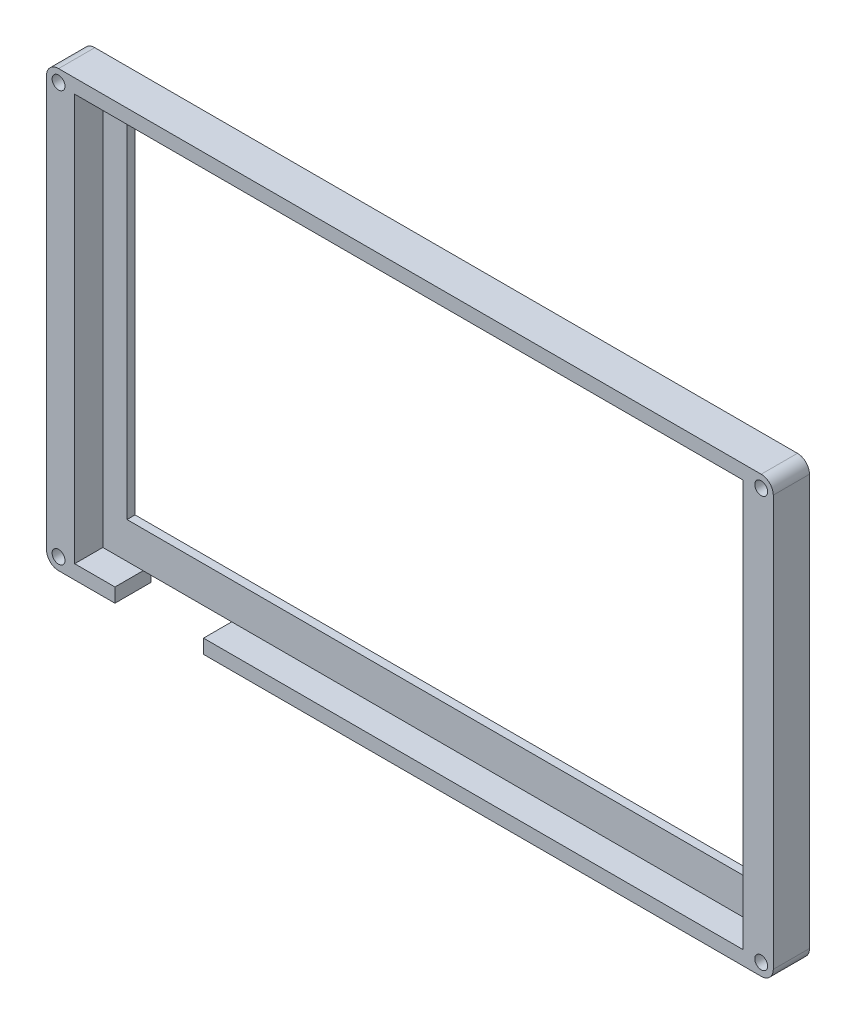
ISO-10303-21;
HEADER;
FILE_DESCRIPTION(('STEP AP214'),'2;1');
FILE_NAME('part.step','',(''),(''),'','','');
FILE_SCHEMA(('AUTOMOTIVE_DESIGN { 1 0 10303 214 1 1 1 1 }'));
ENDSEC;
DATA;
#1=APPLICATION_CONTEXT('core data for automotive mechanical design processes');
#2=APPLICATION_PROTOCOL_DEFINITION('international standard','automotive_design',2000,#1);
#3=PRODUCT_CONTEXT('',#1,'mechanical');
#4=PRODUCT('Part','Part','',(#3));
#5=PRODUCT_RELATED_PRODUCT_CATEGORY('part','',(#4));
#6=PRODUCT_DEFINITION_FORMATION('','',#4);
#7=PRODUCT_DEFINITION_CONTEXT('part definition',#1,'design');
#8=PRODUCT_DEFINITION('design','',#6,#7);
#9=PRODUCT_DEFINITION_SHAPE('','',#8);
#10=(LENGTH_UNIT() NAMED_UNIT(*) SI_UNIT(.MILLI.,.METRE.));
#11=(NAMED_UNIT(*) PLANE_ANGLE_UNIT() SI_UNIT($,.RADIAN.));
#12=(NAMED_UNIT(*) SI_UNIT($,.STERADIAN.) SOLID_ANGLE_UNIT());
#13=UNCERTAINTY_MEASURE_WITH_UNIT(LENGTH_MEASURE(1.E-05),#10,'distance_accuracy_value','');
#14=(GEOMETRIC_REPRESENTATION_CONTEXT(3) GLOBAL_UNCERTAINTY_ASSIGNED_CONTEXT((#13)) GLOBAL_UNIT_ASSIGNED_CONTEXT((#10,
#11,#12)) REPRESENTATION_CONTEXT('',''));
#15=CARTESIAN_POINT('',(0.,0.,0.));
#16=DIRECTION('',(0.,0.,1.));
#17=DIRECTION('',(1.,0.,0.));
#18=AXIS2_PLACEMENT_3D('',#15,#16,#17);
#19=CARTESIAN_POINT('',(3.,3.,9.));
#20=DIRECTION('',(0.,0.,-1.));
#21=DIRECTION('',(-1.,0.,0.));
#22=AXIS2_PLACEMENT_3D('',#19,#20,#21);
#23=PLANE('',#22);
#24=CARTESIAN_POINT('',(3.,3.,9.));
#25=DIRECTION('',(0.,0.,1.));
#26=DIRECTION('',(1.,0.,0.));
#27=AXIS2_PLACEMENT_3D('',#24,#25,#26);
#28=CIRCLE('',#27,1.6);
#29=CARTESIAN_POINT('',(4.6,3.,9.));
#30=VERTEX_POINT('',#29);
#31=EDGE_CURVE('E368',#30,#30,#28,.T.);
#32=ORIENTED_EDGE('',*,*,#31,.F.);
#33=EDGE_LOOP('',(#32));
#34=FACE_BOUND('',#33,.T.);
#35=CARTESIAN_POINT('',(177.5,105.,9.));
#36=DIRECTION('',(0.,0.,1.));
#37=DIRECTION('',(1.,0.,0.));
#38=AXIS2_PLACEMENT_3D('',#35,#36,#37);
#39=CIRCLE('',#38,1.59999999999999);
#40=CARTESIAN_POINT('',(179.1,105.,9.));
#41=VERTEX_POINT('',#40);
#42=EDGE_CURVE('E360',#41,#41,#39,.T.);
#43=ORIENTED_EDGE('',*,*,#42,.F.);
#44=EDGE_LOOP('',(#43));
#45=FACE_BOUND('',#44,.T.);
#46=CARTESIAN_POINT('',(2.99999999999998,105.,9.));
#47=DIRECTION('',(0.,0.,1.));
#48=DIRECTION('',(1.,0.,0.));
#49=AXIS2_PLACEMENT_3D('',#46,#47,#48);
#50=CIRCLE('',#49,1.6);
#51=CARTESIAN_POINT('',(4.59999999999998,105.,9.));
#52=VERTEX_POINT('',#51);
#53=EDGE_CURVE('E352',#52,#52,#50,.T.);
#54=ORIENTED_EDGE('',*,*,#53,.F.);
#55=EDGE_LOOP('',(#54));
#56=FACE_BOUND('',#55,.T.);
#57=CARTESIAN_POINT('',(177.5,3.,9.));
#58=DIRECTION('',(0.,0.,1.));
#59=DIRECTION('',(1.,0.,0.));
#60=AXIS2_PLACEMENT_3D('',#57,#58,#59);
#61=CIRCLE('',#60,1.59999999999999);
#62=CARTESIAN_POINT('',(179.1,3.,9.));
#63=VERTEX_POINT('',#62);
#64=EDGE_CURVE('E344',#63,#63,#61,.T.);
#65=ORIENTED_EDGE('',*,*,#64,.F.);
#66=EDGE_LOOP('',(#65));
#67=FACE_BOUND('',#66,.T.);
#68=DIRECTION('',(0.,1.,0.));
#69=VECTOR('',#68,1.);
#70=CARTESIAN_POINT('',(17.,0.,9.));
#71=LINE('',#70,#69);
#72=CARTESIAN_POINT('',(17.,0.,9.));
#73=VERTEX_POINT('',#72);
#74=CARTESIAN_POINT('',(17.,3.5,9.));
#75=VERTEX_POINT('',#74);
#76=EDGE_CURVE('E192',#73,#75,#71,.T.);
#77=ORIENTED_EDGE('',*,*,#76,.T.);
#78=DIRECTION('',(1.,0.,0.));
#79=VECTOR('',#78,1.);
#80=CARTESIAN_POINT('',(6.99999999999999,3.5,9.));
#81=LINE('',#80,#79);
#82=CARTESIAN_POINT('',(6.99999999999999,3.5,9.));
#83=VERTEX_POINT('',#82);
#84=EDGE_CURVE('E322',#83,#75,#81,.T.);
#85=ORIENTED_EDGE('',*,*,#84,.F.);
#86=DIRECTION('',(0.,-1.,0.));
#87=VECTOR('',#86,1.);
#88=CARTESIAN_POINT('',(6.99999999999998,104.5,9.));
#89=LINE('',#88,#87);
#90=CARTESIAN_POINT('',(6.99999999999998,104.5,9.));
#91=VERTEX_POINT('',#90);
#92=EDGE_CURVE('E326',#91,#83,#89,.T.);
#93=ORIENTED_EDGE('',*,*,#92,.F.);
#94=DIRECTION('',(1.,0.,0.));
#95=VECTOR('',#94,1.);
#96=CARTESIAN_POINT('',(6.99999999999998,104.5,9.));
#97=LINE('',#96,#95);
#98=CARTESIAN_POINT('',(173.,104.5,9.));
#99=VERTEX_POINT('',#98);
#100=EDGE_CURVE('E312',#91,#99,#97,.T.);
#101=ORIENTED_EDGE('',*,*,#100,.T.);
#102=DIRECTION('',(0.,-1.,0.));
#103=VECTOR('',#102,1.);
#104=CARTESIAN_POINT('',(173.,104.5,9.));
#105=LINE('',#104,#103);
#106=CARTESIAN_POINT('',(173.,3.5,9.));
#107=VERTEX_POINT('',#106);
#108=EDGE_CURVE('E316',#99,#107,#105,.T.);
#109=ORIENTED_EDGE('',*,*,#108,.T.);
#110=CARTESIAN_POINT('',(39.,3.5,9.));
#111=VERTEX_POINT('',#110);
#112=EDGE_CURVE('E321',#111,#107,#81,.T.);
#113=ORIENTED_EDGE('',*,*,#112,.F.);
#114=DIRECTION('',(0.,-1.,0.));
#115=VECTOR('',#114,1.);
#116=CARTESIAN_POINT('',(39.,0.,9.));
#117=LINE('',#116,#115);
#118=CARTESIAN_POINT('',(39.,0.,9.));
#119=VERTEX_POINT('',#118);
#120=EDGE_CURVE('E59',#111,#119,#117,.T.);
#121=ORIENTED_EDGE('',*,*,#120,.T.);
#122=DIRECTION('',(1.,0.,0.));
#123=VECTOR('',#122,1.);
#124=CARTESIAN_POINT('',(3.,0.,9.));
#125=LINE('',#124,#123);
#126=CARTESIAN_POINT('',(177.5,0.,9.));
#127=VERTEX_POINT('',#126);
#128=EDGE_CURVE('E378',#119,#127,#125,.T.);
#129=ORIENTED_EDGE('',*,*,#128,.T.);
#130=CARTESIAN_POINT('',(177.5,3.,9.));
#131=DIRECTION('',(0.,0.,1.));
#132=DIRECTION('',(1.,0.,0.));
#133=AXIS2_PLACEMENT_3D('',#130,#131,#132);
#134=CIRCLE('',#133,2.99999999999999);
#135=CARTESIAN_POINT('',(180.5,3.,9.));
#136=VERTEX_POINT('',#135);
#137=EDGE_CURVE('E382',#127,#136,#134,.T.);
#138=ORIENTED_EDGE('',*,*,#137,.T.);
#139=DIRECTION('',(0.,1.,0.));
#140=VECTOR('',#139,1.);
#141=CARTESIAN_POINT('',(180.5,3.,9.));
#142=LINE('',#141,#140);
#143=CARTESIAN_POINT('',(180.5,105.,9.));
#144=VERTEX_POINT('',#143);
#145=EDGE_CURVE('E385',#136,#144,#142,.T.);
#146=ORIENTED_EDGE('',*,*,#145,.T.);
#147=CARTESIAN_POINT('',(177.5,105.,9.));
#148=DIRECTION('',(0.,0.,1.));
#149=DIRECTION('',(1.,0.,0.));
#150=AXIS2_PLACEMENT_3D('',#147,#148,#149);
#151=CIRCLE('',#150,2.99999999999997);
#152=CARTESIAN_POINT('',(177.5,108.,9.));
#153=VERTEX_POINT('',#152);
#154=EDGE_CURVE('E388',#144,#153,#151,.T.);
#155=ORIENTED_EDGE('',*,*,#154,.T.);
#156=DIRECTION('',(-1.,0.,0.));
#157=VECTOR('',#156,1.);
#158=CARTESIAN_POINT('',(2.99999999999998,108.,9.));
#159=LINE('',#158,#157);
#160=CARTESIAN_POINT('',(2.99999999999998,108.,9.));
#161=VERTEX_POINT('',#160);
#162=EDGE_CURVE('E391',#153,#161,#159,.T.);
#163=ORIENTED_EDGE('',*,*,#162,.T.);
#164=CARTESIAN_POINT('',(2.99999999999998,105.,9.));
#165=DIRECTION('',(0.,0.,1.));
#166=DIRECTION('',(-1.,0.,0.));
#167=AXIS2_PLACEMENT_3D('',#164,#165,#166);
#168=CIRCLE('',#167,3.);
#169=CARTESIAN_POINT('',(0.,105.,9.));
#170=VERTEX_POINT('',#169);
#171=EDGE_CURVE('E394',#161,#170,#168,.T.);
#172=ORIENTED_EDGE('',*,*,#171,.T.);
#173=DIRECTION('',(0.,-1.,0.));
#174=VECTOR('',#173,1.);
#175=CARTESIAN_POINT('',(0.,3.,9.));
#176=LINE('',#175,#174);
#177=CARTESIAN_POINT('',(0.,3.,9.));
#178=VERTEX_POINT('',#177);
#179=EDGE_CURVE('E247',#170,#178,#176,.T.);
#180=ORIENTED_EDGE('',*,*,#179,.T.);
#181=CARTESIAN_POINT('',(3.,3.,9.));
#182=DIRECTION('',(0.,0.,1.));
#183=DIRECTION('',(-1.,0.,0.));
#184=AXIS2_PLACEMENT_3D('',#181,#182,#183);
#185=CIRCLE('',#184,3.);
#186=CARTESIAN_POINT('',(3.,0.,9.));
#187=VERTEX_POINT('',#186);
#188=EDGE_CURVE('E241',#178,#187,#185,.T.);
#189=ORIENTED_EDGE('',*,*,#188,.T.);
#190=EDGE_CURVE('E379',#187,#73,#125,.T.);
#191=ORIENTED_EDGE('',*,*,#190,.T.);
#192=EDGE_LOOP('',(#77,#85,#93,#101,#109,#113,#121,#129,#138,#146,#155,#163,#172,#180,#189,#191));
#193=FACE_BOUND('',#192,.T.);
#194=ADVANCED_FACE('F43',(#34,#45,#56,#67,#193),#23,.F.);
#195=CARTESIAN_POINT('',(3.,3.,0.));
#196=DIRECTION('',(0.,0.,-1.));
#197=DIRECTION('',(-1.,0.,0.));
#198=AXIS2_PLACEMENT_3D('',#195,#196,#197);
#199=PLANE('',#198);
#200=DIRECTION('',(0.,-1.,0.));
#201=VECTOR('',#200,1.);
#202=CARTESIAN_POINT('',(13.,100.5,0.));
#203=LINE('',#202,#201);
#204=CARTESIAN_POINT('',(13.,100.5,0.));
#205=VERTEX_POINT('',#204);
#206=CARTESIAN_POINT('',(13.,12.5,0.));
#207=VERTEX_POINT('',#206);
#208=EDGE_CURVE('E451',#205,#207,#203,.T.);
#209=ORIENTED_EDGE('',*,*,#208,.T.);
#210=DIRECTION('',(1.,0.,0.));
#211=VECTOR('',#210,1.);
#212=CARTESIAN_POINT('',(13.,12.5,0.));
#213=LINE('',#212,#211);
#214=CARTESIAN_POINT('',(170.,12.5,0.));
#215=VERTEX_POINT('',#214);
#216=EDGE_CURVE('E455',#207,#215,#213,.T.);
#217=ORIENTED_EDGE('',*,*,#216,.T.);
#218=DIRECTION('',(0.,1.,0.));
#219=VECTOR('',#218,1.);
#220=CARTESIAN_POINT('',(170.,100.5,0.));
#221=LINE('',#220,#219);
#222=CARTESIAN_POINT('',(170.,100.5,0.));
#223=VERTEX_POINT('',#222);
#224=EDGE_CURVE('E460',#215,#223,#221,.T.);
#225=ORIENTED_EDGE('',*,*,#224,.T.);
#226=DIRECTION('',(-1.,0.,0.));
#227=VECTOR('',#226,1.);
#228=CARTESIAN_POINT('',(13.,100.5,0.));
#229=LINE('',#228,#227);
#230=EDGE_CURVE('E464',#223,#205,#229,.T.);
#231=ORIENTED_EDGE('',*,*,#230,.T.);
#232=EDGE_LOOP('',(#209,#217,#225,#231));
#233=FACE_BOUND('',#232,.T.);
#234=CARTESIAN_POINT('',(2.99999999999998,105.,0.));
#235=DIRECTION('',(0.,0.,1.));
#236=DIRECTION('',(1.,0.,0.));
#237=AXIS2_PLACEMENT_3D('',#234,#235,#236);
#238=CIRCLE('',#237,1.6);
#239=CARTESIAN_POINT('',(4.59999999999998,105.,0.));
#240=VERTEX_POINT('',#239);
#241=EDGE_CURVE('E348',#240,#240,#238,.T.);
#242=ORIENTED_EDGE('',*,*,#241,.T.);
#243=EDGE_LOOP('',(#242));
#244=FACE_BOUND('',#243,.T.);
#245=CARTESIAN_POINT('',(3.,3.,0.));
#246=DIRECTION('',(0.,0.,1.));
#247=DIRECTION('',(1.,0.,0.));
#248=AXIS2_PLACEMENT_3D('',#245,#246,#247);
#249=CIRCLE('',#248,1.6);
#250=CARTESIAN_POINT('',(4.6,3.,0.));
#251=VERTEX_POINT('',#250);
#252=EDGE_CURVE('E364',#251,#251,#249,.T.);
#253=ORIENTED_EDGE('',*,*,#252,.T.);
#254=EDGE_LOOP('',(#253));
#255=FACE_BOUND('',#254,.T.);
#256=CARTESIAN_POINT('',(177.5,105.,0.));
#257=DIRECTION('',(0.,0.,1.));
#258=DIRECTION('',(1.,0.,0.));
#259=AXIS2_PLACEMENT_3D('',#256,#257,#258);
#260=CIRCLE('',#259,1.59999999999999);
#261=CARTESIAN_POINT('',(179.1,105.,0.));
#262=VERTEX_POINT('',#261);
#263=EDGE_CURVE('E356',#262,#262,#260,.T.);
#264=ORIENTED_EDGE('',*,*,#263,.T.);
#265=EDGE_LOOP('',(#264));
#266=FACE_BOUND('',#265,.T.);
#267=CARTESIAN_POINT('',(177.5,3.,0.));
#268=DIRECTION('',(0.,0.,1.));
#269=DIRECTION('',(1.,0.,0.));
#270=AXIS2_PLACEMENT_3D('',#267,#268,#269);
#271=CIRCLE('',#270,1.59999999999999);
#272=CARTESIAN_POINT('',(179.1,3.,0.));
#273=VERTEX_POINT('',#272);
#274=EDGE_CURVE('E343',#273,#273,#271,.T.);
#275=ORIENTED_EDGE('',*,*,#274,.T.);
#276=EDGE_LOOP('',(#275));
#277=FACE_BOUND('',#276,.T.);
#278=DIRECTION('',(-1.,0.,0.));
#279=VECTOR('',#278,1.);
#280=CARTESIAN_POINT('',(0.,3.5,0.));
#281=LINE('',#280,#279);
#282=CARTESIAN_POINT('',(39.,3.5,0.));
#283=VERTEX_POINT('',#282);
#284=CARTESIAN_POINT('',(17.,3.5,0.));
#285=VERTEX_POINT('',#284);
#286=EDGE_CURVE('E198',#283,#285,#281,.T.);
#287=ORIENTED_EDGE('',*,*,#286,.T.);
#288=DIRECTION('',(0.,1.,0.));
#289=VECTOR('',#288,1.);
#290=CARTESIAN_POINT('',(17.,0.,0.));
#291=LINE('',#290,#289);
#292=CARTESIAN_POINT('',(17.,0.,0.));
#293=VERTEX_POINT('',#292);
#294=EDGE_CURVE('E189',#293,#285,#291,.T.);
#295=ORIENTED_EDGE('',*,*,#294,.F.);
#296=DIRECTION('',(1.,0.,0.));
#297=VECTOR('',#296,1.);
#298=CARTESIAN_POINT('',(3.,0.,0.));
#299=LINE('',#298,#297);
#300=CARTESIAN_POINT('',(3.,0.,0.));
#301=VERTEX_POINT('',#300);
#302=EDGE_CURVE('E204',#301,#293,#299,.T.);
#303=ORIENTED_EDGE('',*,*,#302,.F.);
#304=CARTESIAN_POINT('',(3.,3.,0.));
#305=DIRECTION('',(0.,0.,1.));
#306=DIRECTION('',(-1.,0.,0.));
#307=AXIS2_PLACEMENT_3D('',#304,#305,#306);
#308=CIRCLE('',#307,3.);
#309=CARTESIAN_POINT('',(0.,3.,0.));
#310=VERTEX_POINT('',#309);
#311=EDGE_CURVE('E223',#310,#301,#308,.T.);
#312=ORIENTED_EDGE('',*,*,#311,.F.);
#313=DIRECTION('',(0.,-1.,0.));
#314=VECTOR('',#313,1.);
#315=CARTESIAN_POINT('',(0.,3.,0.));
#316=LINE('',#315,#314);
#317=CARTESIAN_POINT('',(0.,105.,0.));
#318=VERTEX_POINT('',#317);
#319=EDGE_CURVE('E238',#318,#310,#316,.T.);
#320=ORIENTED_EDGE('',*,*,#319,.F.);
#321=CARTESIAN_POINT('',(2.99999999999998,105.,0.));
#322=DIRECTION('',(0.,0.,1.));
#323=DIRECTION('',(-1.,0.,0.));
#324=AXIS2_PLACEMENT_3D('',#321,#322,#323);
#325=CIRCLE('',#324,3.);
#326=CARTESIAN_POINT('',(2.99999999999998,108.,0.));
#327=VERTEX_POINT('',#326);
#328=EDGE_CURVE('E235',#327,#318,#325,.T.);
#329=ORIENTED_EDGE('',*,*,#328,.F.);
#330=DIRECTION('',(-1.,0.,0.));
#331=VECTOR('',#330,1.);
#332=CARTESIAN_POINT('',(2.99999999999998,108.,0.));
#333=LINE('',#332,#331);
#334=CARTESIAN_POINT('',(177.5,108.,0.));
#335=VERTEX_POINT('',#334);
#336=EDGE_CURVE('E232',#335,#327,#333,.T.);
#337=ORIENTED_EDGE('',*,*,#336,.F.);
#338=CARTESIAN_POINT('',(177.5,105.,0.));
#339=DIRECTION('',(0.,0.,1.));
#340=DIRECTION('',(1.,0.,0.));
#341=AXIS2_PLACEMENT_3D('',#338,#339,#340);
#342=CIRCLE('',#341,2.99999999999997);
#343=CARTESIAN_POINT('',(180.5,105.,0.));
#344=VERTEX_POINT('',#343);
#345=EDGE_CURVE('E229',#344,#335,#342,.T.);
#346=ORIENTED_EDGE('',*,*,#345,.F.);
#347=DIRECTION('',(0.,1.,0.));
#348=VECTOR('',#347,1.);
#349=CARTESIAN_POINT('',(180.5,3.,0.));
#350=LINE('',#349,#348);
#351=CARTESIAN_POINT('',(180.5,3.,0.));
#352=VERTEX_POINT('',#351);
#353=EDGE_CURVE('E221',#352,#344,#350,.T.);
#354=ORIENTED_EDGE('',*,*,#353,.F.);
#355=CARTESIAN_POINT('',(177.5,3.,0.));
#356=DIRECTION('',(0.,0.,1.));
#357=DIRECTION('',(1.,0.,0.));
#358=AXIS2_PLACEMENT_3D('',#355,#356,#357);
#359=CIRCLE('',#358,2.99999999999999);
#360=CARTESIAN_POINT('',(177.5,0.,0.));
#361=VERTEX_POINT('',#360);
#362=EDGE_CURVE('E216',#361,#352,#359,.T.);
#363=ORIENTED_EDGE('',*,*,#362,.F.);
#364=CARTESIAN_POINT('',(39.,0.,0.));
#365=VERTEX_POINT('',#364);
#366=EDGE_CURVE('E217',#365,#361,#299,.T.);
#367=ORIENTED_EDGE('',*,*,#366,.F.);
#368=DIRECTION('',(0.,-1.,0.));
#369=VECTOR('',#368,1.);
#370=CARTESIAN_POINT('',(39.,0.,0.));
#371=LINE('',#370,#369);
#372=EDGE_CURVE('E209',#283,#365,#371,.T.);
#373=ORIENTED_EDGE('',*,*,#372,.F.);
#374=EDGE_LOOP('',(#287,#295,#303,#312,#320,#329,#337,#346,#354,#363,#367,#373));
#375=FACE_BOUND('',#374,.T.);
#376=ADVANCED_FACE('F202',(#233,#244,#255,#266,#277,#375),#199,.T.);
#377=CARTESIAN_POINT('',(3.,0.,9.));
#378=DIRECTION('',(0.,1.,0.));
#379=DIRECTION('',(0.,0.,1.));
#380=AXIS2_PLACEMENT_3D('',#377,#378,#379);
#381=PLANE('',#380);
#382=DIRECTION('',(0.,0.,1.));
#383=VECTOR('',#382,1.);
#384=CARTESIAN_POINT('',(17.,0.,0.));
#385=LINE('',#384,#383);
#386=EDGE_CURVE('E185',#293,#73,#385,.T.);
#387=ORIENTED_EDGE('',*,*,#386,.T.);
#388=ORIENTED_EDGE('',*,*,#190,.F.);
#389=DIRECTION('',(0.,0.,-1.));
#390=VECTOR('',#389,1.);
#391=CARTESIAN_POINT('',(3.,0.,9.));
#392=LINE('',#391,#390);
#393=EDGE_CURVE('E213',#187,#301,#392,.T.);
#394=ORIENTED_EDGE('',*,*,#393,.T.);
#395=ORIENTED_EDGE('',*,*,#302,.T.);
#396=EDGE_LOOP('',(#387,#388,#394,#395));
#397=FACE_BOUND('',#396,.T.);
#398=ADVANCED_FACE('F211',(#397),#381,.F.);
#399=DIRECTION('',(0.,0.,1.));
#400=VECTOR('',#399,1.);
#401=CARTESIAN_POINT('',(39.,0.,0.));
#402=LINE('',#401,#400);
#403=EDGE_CURVE('E197',#365,#119,#402,.T.);
#404=ORIENTED_EDGE('',*,*,#403,.F.);
#405=ORIENTED_EDGE('',*,*,#366,.T.);
#406=DIRECTION('',(0.,0.,-1.));
#407=VECTOR('',#406,1.);
#408=CARTESIAN_POINT('',(177.5,0.,9.));
#409=LINE('',#408,#407);
#410=EDGE_CURVE('E267',#127,#361,#409,.T.);
#411=ORIENTED_EDGE('',*,*,#410,.F.);
#412=ORIENTED_EDGE('',*,*,#128,.F.);
#413=EDGE_LOOP('',(#404,#405,#411,#412));
#414=FACE_BOUND('',#413,.T.);
#415=ADVANCED_FACE('F436',(#414),#381,.F.);
#416=CARTESIAN_POINT('',(6.99999999999999,3.5,2.));
#417=DIRECTION('',(0.,-1.,0.));
#418=DIRECTION('',(0.,0.,-1.));
#419=AXIS2_PLACEMENT_3D('',#416,#417,#418);
#420=PLANE('',#419);
#421=DIRECTION('',(0.,0.,1.));
#422=VECTOR('',#421,1.);
#423=CARTESIAN_POINT('',(17.,3.5,2.));
#424=LINE('',#423,#422);
#425=CARTESIAN_POINT('',(17.,3.5,2.));
#426=VERTEX_POINT('',#425);
#427=EDGE_CURVE('E11',#426,#75,#424,.T.);
#428=ORIENTED_EDGE('',*,*,#427,.F.);
#429=DIRECTION('',(1.,0.,0.));
#430=VECTOR('',#429,1.);
#431=CARTESIAN_POINT('',(6.99999999999999,3.5,2.));
#432=LINE('',#431,#430);
#433=CARTESIAN_POINT('',(6.99999999999999,3.5,2.));
#434=VERTEX_POINT('',#433);
#435=EDGE_CURVE('E296',#434,#426,#432,.T.);
#436=ORIENTED_EDGE('',*,*,#435,.F.);
#437=DIRECTION('',(0.,0.,1.));
#438=VECTOR('',#437,1.);
#439=CARTESIAN_POINT('',(6.99999999999999,3.5,2.));
#440=LINE('',#439,#438);
#441=EDGE_CURVE('E334',#434,#83,#440,.T.);
#442=ORIENTED_EDGE('',*,*,#441,.T.);
#443=ORIENTED_EDGE('',*,*,#84,.T.);
#444=EDGE_LOOP('',(#428,#436,#442,#443));
#445=FACE_BOUND('',#444,.T.);
#446=ADVANCED_FACE('F504',(#445),#420,.F.);
#447=DIRECTION('',(0.,0.,-1.));
#448=VECTOR('',#447,1.);
#449=CARTESIAN_POINT('',(39.,3.5,2.));
#450=LINE('',#449,#448);
#451=CARTESIAN_POINT('',(39.,3.5,2.));
#452=VERTEX_POINT('',#451);
#453=EDGE_CURVE('E52',#111,#452,#450,.T.);
#454=ORIENTED_EDGE('',*,*,#453,.F.);
#455=ORIENTED_EDGE('',*,*,#112,.T.);
#456=DIRECTION('',(0.,0.,1.));
#457=VECTOR('',#456,1.);
#458=CARTESIAN_POINT('',(173.,3.5,2.));
#459=LINE('',#458,#457);
#460=CARTESIAN_POINT('',(173.,3.5,2.));
#461=VERTEX_POINT('',#460);
#462=EDGE_CURVE('E290',#461,#107,#459,.T.);
#463=ORIENTED_EDGE('',*,*,#462,.F.);
#464=EDGE_CURVE('E287',#452,#461,#432,.T.);
#465=ORIENTED_EDGE('',*,*,#464,.F.);
#466=EDGE_LOOP('',(#454,#455,#463,#465));
#467=FACE_BOUND('',#466,.T.);
#468=ADVANCED_FACE('F288',(#467),#420,.F.);
#469=CARTESIAN_POINT('',(0.,0.,2.));
#470=DIRECTION('',(0.,0.,-1.));
#471=DIRECTION('',(-1.,0.,0.));
#472=AXIS2_PLACEMENT_3D('',#469,#470,#471);
#473=PLANE('',#472);
#474=DIRECTION('',(1.,0.,0.));
#475=VECTOR('',#474,1.);
#476=CARTESIAN_POINT('',(6.99999999999998,104.5,2.));
#477=LINE('',#476,#475);
#478=CARTESIAN_POINT('',(6.99999999999998,104.5,2.));
#479=VERTEX_POINT('',#478);
#480=CARTESIAN_POINT('',(173.,104.5,2.));
#481=VERTEX_POINT('',#480);
#482=EDGE_CURVE('E330',#479,#481,#477,.T.);
#483=ORIENTED_EDGE('',*,*,#482,.F.);
#484=DIRECTION('',(0.,-1.,0.));
#485=VECTOR('',#484,1.);
#486=CARTESIAN_POINT('',(6.99999999999998,104.5,2.));
#487=LINE('',#486,#485);
#488=EDGE_CURVE('E305',#479,#434,#487,.T.);
#489=ORIENTED_EDGE('',*,*,#488,.T.);
#490=ORIENTED_EDGE('',*,*,#435,.T.);
#491=EDGE_CURVE('E282',#426,#452,#432,.T.);
#492=ORIENTED_EDGE('',*,*,#491,.T.);
#493=ORIENTED_EDGE('',*,*,#464,.T.);
#494=DIRECTION('',(0.,-1.,0.));
#495=VECTOR('',#494,1.);
#496=CARTESIAN_POINT('',(173.,104.5,2.));
#497=LINE('',#496,#495);
#498=EDGE_CURVE('E294',#481,#461,#497,.T.);
#499=ORIENTED_EDGE('',*,*,#498,.F.);
#500=EDGE_LOOP('',(#483,#489,#490,#492,#493,#499));
#501=FACE_BOUND('',#500,.T.);
#502=DIRECTION('',(0.,-1.,0.));
#503=VECTOR('',#502,1.);
#504=CARTESIAN_POINT('',(13.,100.5,2.));
#505=LINE('',#504,#503);
#506=CARTESIAN_POINT('',(13.,100.5,2.));
#507=VERTEX_POINT('',#506);
#508=CARTESIAN_POINT('',(13.,12.5,2.));
#509=VERTEX_POINT('',#508);
#510=EDGE_CURVE('E447',#507,#509,#505,.T.);
#511=ORIENTED_EDGE('',*,*,#510,.F.);
#512=DIRECTION('',(-1.,0.,0.));
#513=VECTOR('',#512,1.);
#514=CARTESIAN_POINT('',(13.,100.5,2.));
#515=LINE('',#514,#513);
#516=CARTESIAN_POINT('',(170.,100.5,2.));
#517=VERTEX_POINT('',#516);
#518=EDGE_CURVE('E456',#517,#507,#515,.T.);
#519=ORIENTED_EDGE('',*,*,#518,.F.);
#520=DIRECTION('',(0.,1.,0.));
#521=VECTOR('',#520,1.);
#522=CARTESIAN_POINT('',(170.,100.5,2.));
#523=LINE('',#522,#521);
#524=CARTESIAN_POINT('',(170.,12.5,2.));
#525=VERTEX_POINT('',#524);
#526=EDGE_CURVE('E67',#525,#517,#523,.T.);
#527=ORIENTED_EDGE('',*,*,#526,.F.);
#528=DIRECTION('',(1.,0.,0.));
#529=VECTOR('',#528,1.);
#530=CARTESIAN_POINT('',(13.,12.5,2.));
#531=LINE('',#530,#529);
#532=EDGE_CURVE('E472',#509,#525,#531,.T.);
#533=ORIENTED_EDGE('',*,*,#532,.F.);
#534=EDGE_LOOP('',(#511,#519,#527,#533));
#535=FACE_BOUND('',#534,.T.);
#536=ADVANCED_FACE('F299',(#501,#535),#473,.F.);
#537=CARTESIAN_POINT('',(3.,3.,9.));
#538=DIRECTION('',(0.,0.,-1.));
#539=DIRECTION('',(-1.,0.,0.));
#540=AXIS2_PLACEMENT_3D('',#537,#538,#539);
#541=CYLINDRICAL_SURFACE('',#540,3.);
#542=ORIENTED_EDGE('',*,*,#311,.T.);
#543=ORIENTED_EDGE('',*,*,#393,.F.);
#544=ORIENTED_EDGE('',*,*,#188,.F.);
#545=DIRECTION('',(0.,0.,-1.));
#546=VECTOR('',#545,1.);
#547=CARTESIAN_POINT('',(0.,3.,9.));
#548=LINE('',#547,#546);
#549=EDGE_CURVE('E242',#178,#310,#548,.T.);
#550=ORIENTED_EDGE('',*,*,#549,.T.);
#551=EDGE_LOOP('',(#542,#543,#544,#550));
#552=FACE_BOUND('',#551,.T.);
#553=ADVANCED_FACE('F45',(#552),#541,.T.);
#554=CARTESIAN_POINT('',(177.5,3.,9.));
#555=DIRECTION('',(0.,0.,-1.));
#556=DIRECTION('',(-1.,0.,0.));
#557=AXIS2_PLACEMENT_3D('',#554,#555,#556);
#558=CYLINDRICAL_SURFACE('',#557,2.99999999999999);
#559=ORIENTED_EDGE('',*,*,#362,.T.);
#560=DIRECTION('',(0.,0.,-1.));
#561=VECTOR('',#560,1.);
#562=CARTESIAN_POINT('',(180.5,3.,9.));
#563=LINE('',#562,#561);
#564=EDGE_CURVE('E263',#136,#352,#563,.T.);
#565=ORIENTED_EDGE('',*,*,#564,.F.);
#566=ORIENTED_EDGE('',*,*,#137,.F.);
#567=ORIENTED_EDGE('',*,*,#410,.T.);
#568=EDGE_LOOP('',(#559,#565,#566,#567));
#569=FACE_BOUND('',#568,.T.);
#570=ADVANCED_FACE('F431',(#569),#558,.T.);
#571=CARTESIAN_POINT('',(180.5,3.,9.));
#572=DIRECTION('',(-1.,0.,0.));
#573=DIRECTION('',(0.,-1.,0.));
#574=AXIS2_PLACEMENT_3D('',#571,#572,#573);
#575=PLANE('',#574);
#576=ORIENTED_EDGE('',*,*,#353,.T.);
#577=DIRECTION('',(0.,0.,-1.));
#578=VECTOR('',#577,1.);
#579=CARTESIAN_POINT('',(180.5,105.,9.));
#580=LINE('',#579,#578);
#581=EDGE_CURVE('E259',#144,#344,#580,.T.);
#582=ORIENTED_EDGE('',*,*,#581,.F.);
#583=ORIENTED_EDGE('',*,*,#145,.F.);
#584=ORIENTED_EDGE('',*,*,#564,.T.);
#585=EDGE_LOOP('',(#576,#582,#583,#584));
#586=FACE_BOUND('',#585,.T.);
#587=ADVANCED_FACE('F426',(#586),#575,.F.);
#588=CARTESIAN_POINT('',(177.5,105.,9.));
#589=DIRECTION('',(0.,0.,-1.));
#590=DIRECTION('',(-1.,0.,0.));
#591=AXIS2_PLACEMENT_3D('',#588,#589,#590);
#592=CYLINDRICAL_SURFACE('',#591,2.99999999999997);
#593=ORIENTED_EDGE('',*,*,#345,.T.);
#594=DIRECTION('',(0.,0.,-1.));
#595=VECTOR('',#594,1.);
#596=CARTESIAN_POINT('',(177.5,108.,9.));
#597=LINE('',#596,#595);
#598=EDGE_CURVE('E255',#153,#335,#597,.T.);
#599=ORIENTED_EDGE('',*,*,#598,.F.);
#600=ORIENTED_EDGE('',*,*,#154,.F.);
#601=ORIENTED_EDGE('',*,*,#581,.T.);
#602=EDGE_LOOP('',(#593,#599,#600,#601));
#603=FACE_BOUND('',#602,.T.);
#604=ADVANCED_FACE('F420',(#603),#592,.T.);
#605=CARTESIAN_POINT('',(2.99999999999998,108.,9.));
#606=DIRECTION('',(0.,-1.,0.));
#607=DIRECTION('',(1.,0.,0.));
#608=AXIS2_PLACEMENT_3D('',#605,#606,#607);
#609=PLANE('',#608);
#610=ORIENTED_EDGE('',*,*,#336,.T.);
#611=DIRECTION('',(0.,0.,-1.));
#612=VECTOR('',#611,1.);
#613=CARTESIAN_POINT('',(2.99999999999998,108.,9.));
#614=LINE('',#613,#612);
#615=EDGE_CURVE('E251',#161,#327,#614,.T.);
#616=ORIENTED_EDGE('',*,*,#615,.F.);
#617=ORIENTED_EDGE('',*,*,#162,.F.);
#618=ORIENTED_EDGE('',*,*,#598,.T.);
#619=EDGE_LOOP('',(#610,#616,#617,#618));
#620=FACE_BOUND('',#619,.T.);
#621=ADVANCED_FACE('F416',(#620),#609,.F.);
#622=CARTESIAN_POINT('',(2.99999999999998,105.,9.));
#623=DIRECTION('',(0.,0.,-1.));
#624=DIRECTION('',(-1.,0.,0.));
#625=AXIS2_PLACEMENT_3D('',#622,#623,#624);
#626=CYLINDRICAL_SURFACE('',#625,3.);
#627=ORIENTED_EDGE('',*,*,#328,.T.);
#628=DIRECTION('',(0.,0.,-1.));
#629=VECTOR('',#628,1.);
#630=CARTESIAN_POINT('',(0.,105.,9.));
#631=LINE('',#630,#629);
#632=EDGE_CURVE('E246',#170,#318,#631,.T.);
#633=ORIENTED_EDGE('',*,*,#632,.F.);
#634=ORIENTED_EDGE('',*,*,#171,.F.);
#635=ORIENTED_EDGE('',*,*,#615,.T.);
#636=EDGE_LOOP('',(#627,#633,#634,#635));
#637=FACE_BOUND('',#636,.T.);
#638=ADVANCED_FACE('F412',(#637),#626,.T.);
#639=CARTESIAN_POINT('',(0.,3.,9.));
#640=DIRECTION('',(1.,0.,0.));
#641=DIRECTION('',(0.,1.,0.));
#642=AXIS2_PLACEMENT_3D('',#639,#640,#641);
#643=PLANE('',#642);
#644=ORIENTED_EDGE('',*,*,#319,.T.);
#645=ORIENTED_EDGE('',*,*,#549,.F.);
#646=ORIENTED_EDGE('',*,*,#179,.F.);
#647=ORIENTED_EDGE('',*,*,#632,.T.);
#648=EDGE_LOOP('',(#644,#645,#646,#647));
#649=FACE_BOUND('',#648,.T.);
#650=ADVANCED_FACE('F404',(#649),#643,.F.);
#651=CARTESIAN_POINT('',(3.,3.,9.));
#652=DIRECTION('',(0.,0.,-1.));
#653=DIRECTION('',(-1.,0.,0.));
#654=AXIS2_PLACEMENT_3D('',#651,#652,#653);
#655=CYLINDRICAL_SURFACE('',#654,1.6);
#656=ORIENTED_EDGE('',*,*,#31,.T.);
#657=EDGE_LOOP('',(#656));
#658=FACE_BOUND('',#657,.T.);
#659=ORIENTED_EDGE('',*,*,#252,.F.);
#660=EDGE_LOOP('',(#659));
#661=FACE_BOUND('',#660,.T.);
#662=ADVANCED_FACE('F528',(#658,#661),#655,.F.);
#663=CARTESIAN_POINT('',(177.5,105.,9.));
#664=DIRECTION('',(0.,0.,-1.));
#665=DIRECTION('',(-1.,0.,0.));
#666=AXIS2_PLACEMENT_3D('',#663,#664,#665);
#667=CYLINDRICAL_SURFACE('',#666,1.59999999999999);
#668=ORIENTED_EDGE('',*,*,#42,.T.);
#669=EDGE_LOOP('',(#668));
#670=FACE_BOUND('',#669,.T.);
#671=ORIENTED_EDGE('',*,*,#263,.F.);
#672=EDGE_LOOP('',(#671));
#673=FACE_BOUND('',#672,.T.);
#674=ADVANCED_FACE('F707',(#670,#673),#667,.F.);
#675=CARTESIAN_POINT('',(2.99999999999998,105.,9.));
#676=DIRECTION('',(0.,0.,-1.));
#677=DIRECTION('',(-1.,0.,0.));
#678=AXIS2_PLACEMENT_3D('',#675,#676,#677);
#679=CYLINDRICAL_SURFACE('',#678,1.6);
#680=ORIENTED_EDGE('',*,*,#53,.T.);
#681=EDGE_LOOP('',(#680));
#682=FACE_BOUND('',#681,.T.);
#683=ORIENTED_EDGE('',*,*,#241,.F.);
#684=EDGE_LOOP('',(#683));
#685=FACE_BOUND('',#684,.T.);
#686=ADVANCED_FACE('F514',(#682,#685),#679,.F.);
#687=CARTESIAN_POINT('',(177.5,3.,9.));
#688=DIRECTION('',(0.,0.,-1.));
#689=DIRECTION('',(-1.,0.,0.));
#690=AXIS2_PLACEMENT_3D('',#687,#688,#689);
#691=CYLINDRICAL_SURFACE('',#690,1.59999999999999);
#692=ORIENTED_EDGE('',*,*,#64,.T.);
#693=EDGE_LOOP('',(#692));
#694=FACE_BOUND('',#693,.T.);
#695=ORIENTED_EDGE('',*,*,#274,.F.);
#696=EDGE_LOOP('',(#695));
#697=FACE_BOUND('',#696,.T.);
#698=ADVANCED_FACE('F507',(#694,#697),#691,.F.);
#699=CARTESIAN_POINT('',(6.99999999999998,104.5,2.));
#700=DIRECTION('',(0.,-1.,0.));
#701=DIRECTION('',(0.,0.,-1.));
#702=AXIS2_PLACEMENT_3D('',#699,#700,#701);
#703=PLANE('',#702);
#704=ORIENTED_EDGE('',*,*,#100,.F.);
#705=DIRECTION('',(0.,0.,1.));
#706=VECTOR('',#705,1.);
#707=CARTESIAN_POINT('',(6.99999999999998,104.5,2.));
#708=LINE('',#707,#706);
#709=EDGE_CURVE('E311',#479,#91,#708,.T.);
#710=ORIENTED_EDGE('',*,*,#709,.F.);
#711=ORIENTED_EDGE('',*,*,#482,.T.);
#712=DIRECTION('',(0.,0.,1.));
#713=VECTOR('',#712,1.);
#714=CARTESIAN_POINT('',(173.,104.5,2.));
#715=LINE('',#714,#713);
#716=EDGE_CURVE('E339',#481,#99,#715,.T.);
#717=ORIENTED_EDGE('',*,*,#716,.T.);
#718=EDGE_LOOP('',(#704,#710,#711,#717));
#719=FACE_BOUND('',#718,.T.);
#720=ADVANCED_FACE('F505',(#719),#703,.T.);
#721=CARTESIAN_POINT('',(173.,104.5,2.));
#722=DIRECTION('',(-1.,0.,0.));
#723=DIRECTION('',(0.,0.,1.));
#724=AXIS2_PLACEMENT_3D('',#721,#722,#723);
#725=PLANE('',#724);
#726=ORIENTED_EDGE('',*,*,#108,.F.);
#727=ORIENTED_EDGE('',*,*,#716,.F.);
#728=ORIENTED_EDGE('',*,*,#498,.T.);
#729=ORIENTED_EDGE('',*,*,#462,.T.);
#730=EDGE_LOOP('',(#726,#727,#728,#729));
#731=FACE_BOUND('',#730,.T.);
#732=ADVANCED_FACE('F496',(#731),#725,.T.);
#733=CARTESIAN_POINT('',(6.99999999999998,104.5,2.));
#734=DIRECTION('',(-1.,0.,0.));
#735=DIRECTION('',(0.,-1.,0.));
#736=AXIS2_PLACEMENT_3D('',#733,#734,#735);
#737=PLANE('',#736);
#738=ORIENTED_EDGE('',*,*,#92,.T.);
#739=ORIENTED_EDGE('',*,*,#441,.F.);
#740=ORIENTED_EDGE('',*,*,#488,.F.);
#741=ORIENTED_EDGE('',*,*,#709,.T.);
#742=EDGE_LOOP('',(#738,#739,#740,#741));
#743=FACE_BOUND('',#742,.T.);
#744=ADVANCED_FACE('F499',(#743),#737,.F.);
#745=CARTESIAN_POINT('',(13.,100.5,0.));
#746=DIRECTION('',(-1.,0.,0.));
#747=DIRECTION('',(0.,-1.,0.));
#748=AXIS2_PLACEMENT_3D('',#745,#746,#747);
#749=PLANE('',#748);
#750=ORIENTED_EDGE('',*,*,#510,.T.);
#751=DIRECTION('',(0.,0.,1.));
#752=VECTOR('',#751,1.);
#753=CARTESIAN_POINT('',(13.,12.5,0.));
#754=LINE('',#753,#752);
#755=EDGE_CURVE('E468',#207,#509,#754,.T.);
#756=ORIENTED_EDGE('',*,*,#755,.F.);
#757=ORIENTED_EDGE('',*,*,#208,.F.);
#758=DIRECTION('',(0.,0.,1.));
#759=VECTOR('',#758,1.);
#760=CARTESIAN_POINT('',(13.,100.5,0.));
#761=LINE('',#760,#759);
#762=EDGE_CURVE('E317',#205,#507,#761,.T.);
#763=ORIENTED_EDGE('',*,*,#762,.T.);
#764=EDGE_LOOP('',(#750,#756,#757,#763));
#765=FACE_BOUND('',#764,.T.);
#766=ADVANCED_FACE('F556',(#765),#749,.F.);
#767=CARTESIAN_POINT('',(13.,100.5,0.));
#768=DIRECTION('',(0.,1.,0.));
#769=DIRECTION('',(0.,0.,1.));
#770=AXIS2_PLACEMENT_3D('',#767,#768,#769);
#771=PLANE('',#770);
#772=ORIENTED_EDGE('',*,*,#518,.T.);
#773=ORIENTED_EDGE('',*,*,#762,.F.);
#774=ORIENTED_EDGE('',*,*,#230,.F.);
#775=DIRECTION('',(0.,0.,1.));
#776=VECTOR('',#775,1.);
#777=CARTESIAN_POINT('',(170.,100.5,0.));
#778=LINE('',#777,#776);
#779=EDGE_CURVE('E483',#223,#517,#778,.T.);
#780=ORIENTED_EDGE('',*,*,#779,.T.);
#781=EDGE_LOOP('',(#772,#773,#774,#780));
#782=FACE_BOUND('',#781,.T.);
#783=ADVANCED_FACE('F561',(#782),#771,.F.);
#784=CARTESIAN_POINT('',(170.,100.5,0.));
#785=DIRECTION('',(1.,0.,0.));
#786=DIRECTION('',(0.,0.,-1.));
#787=AXIS2_PLACEMENT_3D('',#784,#785,#786);
#788=PLANE('',#787);
#789=ORIENTED_EDGE('',*,*,#526,.T.);
#790=ORIENTED_EDGE('',*,*,#779,.F.);
#791=ORIENTED_EDGE('',*,*,#224,.F.);
#792=DIRECTION('',(0.,0.,1.));
#793=VECTOR('',#792,1.);
#794=CARTESIAN_POINT('',(170.,12.5,0.));
#795=LINE('',#794,#793);
#796=EDGE_CURVE('E486',#215,#525,#795,.T.);
#797=ORIENTED_EDGE('',*,*,#796,.T.);
#798=EDGE_LOOP('',(#789,#790,#791,#797));
#799=FACE_BOUND('',#798,.T.);
#800=ADVANCED_FACE('F566',(#799),#788,.F.);
#801=CARTESIAN_POINT('',(13.,12.5,0.));
#802=DIRECTION('',(0.,-1.,0.));
#803=DIRECTION('',(0.,0.,-1.));
#804=AXIS2_PLACEMENT_3D('',#801,#802,#803);
#805=PLANE('',#804);
#806=ORIENTED_EDGE('',*,*,#532,.T.);
#807=ORIENTED_EDGE('',*,*,#796,.F.);
#808=ORIENTED_EDGE('',*,*,#216,.F.);
#809=ORIENTED_EDGE('',*,*,#755,.T.);
#810=EDGE_LOOP('',(#806,#807,#808,#809));
#811=FACE_BOUND('',#810,.T.);
#812=ADVANCED_FACE('F563',(#811),#805,.F.);
#813=CARTESIAN_POINT('',(0.,3.5,0.));
#814=DIRECTION('',(0.,1.,0.));
#815=DIRECTION('',(0.,0.,1.));
#816=AXIS2_PLACEMENT_3D('',#813,#814,#815);
#817=PLANE('',#816);
#818=DIRECTION('',(0.,0.,1.));
#819=VECTOR('',#818,1.);
#820=CARTESIAN_POINT('',(17.,3.5,0.));
#821=LINE('',#820,#819);
#822=EDGE_CURVE('E284',#285,#426,#821,.T.);
#823=ORIENTED_EDGE('',*,*,#822,.F.);
#824=ORIENTED_EDGE('',*,*,#286,.F.);
#825=DIRECTION('',(0.,0.,1.));
#826=VECTOR('',#825,1.);
#827=CARTESIAN_POINT('',(39.,3.5,0.));
#828=LINE('',#827,#826);
#829=EDGE_CURVE('E275',#283,#452,#828,.T.);
#830=ORIENTED_EDGE('',*,*,#829,.T.);
#831=ORIENTED_EDGE('',*,*,#491,.F.);
#832=EDGE_LOOP('',(#823,#824,#830,#831));
#833=FACE_BOUND('',#832,.T.);
#834=ADVANCED_FACE('F280',(#833),#817,.F.);
#835=CARTESIAN_POINT('',(17.,0.,0.));
#836=DIRECTION('',(1.,0.,0.));
#837=DIRECTION('',(0.,0.,-1.));
#838=AXIS2_PLACEMENT_3D('',#835,#836,#837);
#839=PLANE('',#838);
#840=ORIENTED_EDGE('',*,*,#76,.F.);
#841=ORIENTED_EDGE('',*,*,#386,.F.);
#842=ORIENTED_EDGE('',*,*,#294,.T.);
#843=ORIENTED_EDGE('',*,*,#822,.T.);
#844=ORIENTED_EDGE('',*,*,#427,.T.);
#845=EDGE_LOOP('',(#840,#841,#842,#843,#844));
#846=FACE_BOUND('',#845,.T.);
#847=ADVANCED_FACE('F187',(#846),#839,.T.);
#848=CARTESIAN_POINT('',(39.,0.,0.));
#849=DIRECTION('',(-1.,0.,0.));
#850=DIRECTION('',(0.,0.,1.));
#851=AXIS2_PLACEMENT_3D('',#848,#849,#850);
#852=PLANE('',#851);
#853=ORIENTED_EDGE('',*,*,#120,.F.);
#854=ORIENTED_EDGE('',*,*,#453,.T.);
#855=ORIENTED_EDGE('',*,*,#829,.F.);
#856=ORIENTED_EDGE('',*,*,#372,.T.);
#857=ORIENTED_EDGE('',*,*,#403,.T.);
#858=EDGE_LOOP('',(#853,#854,#855,#856,#857));
#859=FACE_BOUND('',#858,.T.);
#860=ADVANCED_FACE('F274',(#859),#852,.T.);
#861=CLOSED_SHELL('',(#194,#376,#398,#415,#446,#468,#536,#553,#570,#587,#604,#621,#638,#650,
#662,#674,#686,#698,#720,#732,#744,#766,#783,#800,#812,#834,#847,#860));
#862=MANIFOLD_SOLID_BREP('B2',#861);
#863=ADVANCED_BREP_SHAPE_REPRESENTATION('',(#18,#862),#14);
#864=SHAPE_DEFINITION_REPRESENTATION(#9,#863);
ENDSEC;
END-ISO-10303-21;
